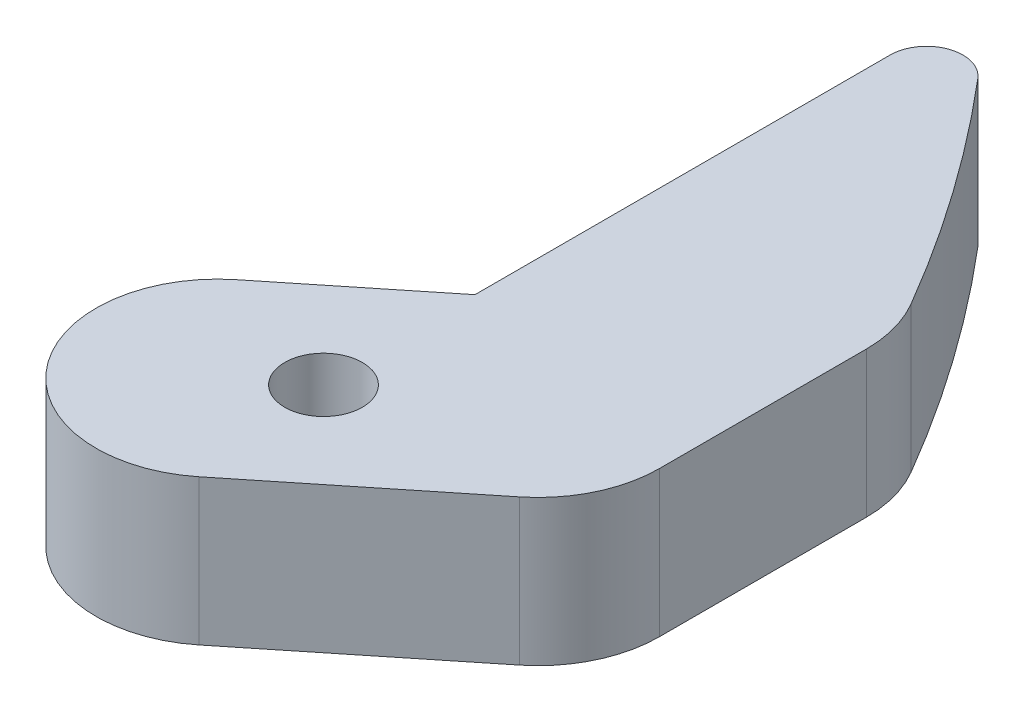
ISO-10303-21;
HEADER;
FILE_DESCRIPTION(('STEP AP214'),'2;1');
FILE_NAME('part.step','',(''),(''),'','','');
FILE_SCHEMA(('AUTOMOTIVE_DESIGN { 1 0 10303 214 1 1 1 1 }'));
ENDSEC;
DATA;
#1=APPLICATION_CONTEXT('core data for automotive mechanical design processes');
#2=APPLICATION_PROTOCOL_DEFINITION('international standard','automotive_design',2000,#1);
#3=PRODUCT_CONTEXT('',#1,'mechanical');
#4=PRODUCT('Part','Part','',(#3));
#5=PRODUCT_RELATED_PRODUCT_CATEGORY('part','',(#4));
#6=PRODUCT_DEFINITION_FORMATION('','',#4);
#7=PRODUCT_DEFINITION_CONTEXT('part definition',#1,'design');
#8=PRODUCT_DEFINITION('design','',#6,#7);
#9=PRODUCT_DEFINITION_SHAPE('','',#8);
#10=(LENGTH_UNIT() NAMED_UNIT(*) SI_UNIT(.MILLI.,.METRE.));
#11=(NAMED_UNIT(*) PLANE_ANGLE_UNIT() SI_UNIT($,.RADIAN.));
#12=(NAMED_UNIT(*) SI_UNIT($,.STERADIAN.) SOLID_ANGLE_UNIT());
#13=UNCERTAINTY_MEASURE_WITH_UNIT(LENGTH_MEASURE(1.E-05),#10,'distance_accuracy_value','');
#14=(GEOMETRIC_REPRESENTATION_CONTEXT(3) GLOBAL_UNCERTAINTY_ASSIGNED_CONTEXT((#13)) GLOBAL_UNIT_ASSIGNED_CONTEXT((#10,
#11,#12)) REPRESENTATION_CONTEXT('',''));
#15=CARTESIAN_POINT('',(0.,0.,0.));
#16=DIRECTION('',(0.,0.,1.));
#17=DIRECTION('',(1.,0.,0.));
#18=AXIS2_PLACEMENT_3D('',#15,#16,#17);
#19=CARTESIAN_POINT('',(-2.42195887519577,-6.,1.94672229834054));
#20=DIRECTION('',(0.,-1.,0.));
#21=DIRECTION('',(0.,0.,-1.));
#22=AXIS2_PLACEMENT_3D('',#19,#20,#21);
#23=CYLINDRICAL_SURFACE('',#22,4.99999999999996);
#24=CARTESIAN_POINT('',(-2.42195887519577,-12.,1.94672229834054));
#25=DIRECTION('',(0.,-1.,0.));
#26=DIRECTION('',(0.,0.,-1.));
#27=AXIS2_PLACEMENT_3D('',#24,#25,#26);
#28=CIRCLE('',#27,4.99999999999996);
#29=CARTESIAN_POINT('',(0.710490736046218,-12.,5.84386990050156));
#30=VERTEX_POINT('',#29);
#31=CARTESIAN_POINT('',(-5.55440848643782,-12.,-1.95042530382048));
#32=VERTEX_POINT('',#31);
#33=EDGE_CURVE('E135',#30,#32,#28,.T.);
#34=ORIENTED_EDGE('',*,*,#33,.F.);
#35=DIRECTION('',(0.,-1.,0.));
#36=VECTOR('',#35,1.);
#37=CARTESIAN_POINT('',(0.710490736046218,-6.,5.84386990050156));
#38=LINE('',#37,#36);
#39=CARTESIAN_POINT('',(0.710490736046218,-6.,5.84386990050156));
#40=VERTEX_POINT('',#39);
#41=EDGE_CURVE('E11',#40,#30,#38,.T.);
#42=ORIENTED_EDGE('',*,*,#41,.F.);
#43=CARTESIAN_POINT('',(-2.42195887519577,-6.,1.94672229834054));
#44=DIRECTION('',(0.,-1.,0.));
#45=DIRECTION('',(0.,0.,-1.));
#46=AXIS2_PLACEMENT_3D('',#43,#44,#45);
#47=CIRCLE('',#46,4.99999999999996);
#48=CARTESIAN_POINT('',(-5.55440848643782,-6.,-1.95042530382048));
#49=VERTEX_POINT('',#48);
#50=EDGE_CURVE('E159',#40,#49,#47,.T.);
#51=ORIENTED_EDGE('',*,*,#50,.T.);
#52=DIRECTION('',(0.,-1.,0.));
#53=VECTOR('',#52,1.);
#54=CARTESIAN_POINT('',(-5.55440848643782,-6.,-1.95042530382048));
#55=LINE('',#54,#53);
#56=EDGE_CURVE('E35',#49,#32,#55,.T.);
#57=ORIENTED_EDGE('',*,*,#56,.T.);
#58=EDGE_LOOP('',(#34,#42,#51,#57));
#59=FACE_BOUND('',#58,.T.);
#60=ADVANCED_FACE('F32',(#59),#23,.T.);
#61=CARTESIAN_POINT('',(8.03404776782973,-6.,-0.0426593560239417));
#62=DIRECTION('',(0.626489922248408,0.,0.779429520432209));
#63=DIRECTION('',(0.779429520432209,0.,-0.626489922248408));
#64=AXIS2_PLACEMENT_3D('',#61,#62,#63);
#65=PLANE('',#64);
#66=DIRECTION('',(-0.779429520432209,0.,0.626489922248408));
#67=VECTOR('',#66,1.);
#68=CARTESIAN_POINT('',(8.03404776782973,-12.,-0.0426593560239417));
#69=LINE('',#68,#67);
#70=CARTESIAN_POINT('',(8.03404776782973,-12.,-0.0426593560239417));
#71=VERTEX_POINT('',#70);
#72=EDGE_CURVE('E157',#71,#30,#69,.T.);
#73=ORIENTED_EDGE('',*,*,#72,.F.);
#74=DIRECTION('',(0.,-1.,0.));
#75=VECTOR('',#74,1.);
#76=CARTESIAN_POINT('',(8.03404776782973,-6.,-0.0426593560239417));
#77=LINE('',#76,#75);
#78=CARTESIAN_POINT('',(8.03404776782973,-6.,-0.0426593560239417));
#79=VERTEX_POINT('',#78);
#80=EDGE_CURVE('E41',#79,#71,#77,.T.);
#81=ORIENTED_EDGE('',*,*,#80,.F.);
#82=DIRECTION('',(-0.779429520432209,0.,0.626489922248408));
#83=VECTOR('',#82,1.);
#84=CARTESIAN_POINT('',(8.03404776782973,-6.,-0.0426593560239417));
#85=LINE('',#84,#83);
#86=EDGE_CURVE('E125',#79,#40,#85,.T.);
#87=ORIENTED_EDGE('',*,*,#86,.T.);
#88=ORIENTED_EDGE('',*,*,#41,.T.);
#89=EDGE_LOOP('',(#73,#81,#87,#88));
#90=FACE_BOUND('',#89,.T.);
#91=ADVANCED_FACE('F173',(#90),#65,.T.);
#92=CARTESIAN_POINT('',(4.90159815658769,-6.,-3.93980695818495));
#93=DIRECTION('',(0.,-1.,0.));
#94=DIRECTION('',(0.,0.,-1.));
#95=AXIS2_PLACEMENT_3D('',#92,#93,#94);
#96=CYLINDRICAL_SURFACE('',#95,4.99999999999999);
#97=CARTESIAN_POINT('',(4.90159815658769,-12.,-3.93980695818495));
#98=DIRECTION('',(0.,-1.,0.));
#99=DIRECTION('',(0.,0.,-1.));
#100=AXIS2_PLACEMENT_3D('',#97,#98,#99);
#101=CIRCLE('',#100,4.99999999999999);
#102=CARTESIAN_POINT('',(9.90159815658768,-12.,-3.93980695818495));
#103=VERTEX_POINT('',#102);
#104=EDGE_CURVE('E112',#103,#71,#101,.T.);
#105=ORIENTED_EDGE('',*,*,#104,.F.);
#106=DIRECTION('',(0.,-1.,0.));
#107=VECTOR('',#106,1.);
#108=CARTESIAN_POINT('',(9.90159815658768,-6.,-3.93980695818495));
#109=LINE('',#108,#107);
#110=CARTESIAN_POINT('',(9.90159815658768,-6.,-3.93980695818495));
#111=VERTEX_POINT('',#110);
#112=EDGE_CURVE('E107',#111,#103,#109,.T.);
#113=ORIENTED_EDGE('',*,*,#112,.F.);
#114=CARTESIAN_POINT('',(4.90159815658769,-6.,-3.93980695818495));
#115=DIRECTION('',(0.,-1.,0.));
#116=DIRECTION('',(0.,0.,-1.));
#117=AXIS2_PLACEMENT_3D('',#114,#115,#116);
#118=CIRCLE('',#117,4.99999999999999);
#119=EDGE_CURVE('E110',#111,#79,#118,.T.);
#120=ORIENTED_EDGE('',*,*,#119,.T.);
#121=ORIENTED_EDGE('',*,*,#80,.T.);
#122=EDGE_LOOP('',(#105,#113,#120,#121));
#123=FACE_BOUND('',#122,.T.);
#124=ADVANCED_FACE('F109',(#123),#96,.T.);
#125=CARTESIAN_POINT('',(9.90159815658769,-6.,-12.4542911190457));
#126=DIRECTION('',(1.,0.,0.));
#127=DIRECTION('',(0.,0.,-1.));
#128=AXIS2_PLACEMENT_3D('',#125,#126,#127);
#129=PLANE('',#128);
#130=DIRECTION('',(0.,0.,1.));
#131=VECTOR('',#130,1.);
#132=CARTESIAN_POINT('',(9.90159815658769,-12.,-12.4542911190457));
#133=LINE('',#132,#131);
#134=CARTESIAN_POINT('',(9.90159815658769,-12.,-12.4542911190457));
#135=VERTEX_POINT('',#134);
#136=EDGE_CURVE('E154',#135,#103,#133,.T.);
#137=ORIENTED_EDGE('',*,*,#136,.F.);
#138=DIRECTION('',(0.,-1.,0.));
#139=VECTOR('',#138,1.);
#140=CARTESIAN_POINT('',(9.90159815658769,-6.,-12.4542911190457));
#141=LINE('',#140,#139);
#142=CARTESIAN_POINT('',(9.90159815658769,-6.,-12.4542911190457));
#143=VERTEX_POINT('',#142);
#144=EDGE_CURVE('E117',#143,#135,#141,.T.);
#145=ORIENTED_EDGE('',*,*,#144,.F.);
#146=DIRECTION('',(0.,0.,1.));
#147=VECTOR('',#146,1.);
#148=CARTESIAN_POINT('',(9.90159815658769,-6.,-12.4542911190457));
#149=LINE('',#148,#147);
#150=EDGE_CURVE('E123',#143,#111,#149,.T.);
#151=ORIENTED_EDGE('',*,*,#150,.T.);
#152=ORIENTED_EDGE('',*,*,#112,.T.);
#153=EDGE_LOOP('',(#137,#145,#151,#152));
#154=FACE_BOUND('',#153,.T.);
#155=ADVANCED_FACE('F127',(#154),#129,.T.);
#156=CARTESIAN_POINT('',(4.90159815658768,-6.,-12.4542911190457));
#157=DIRECTION('',(0.,-1.,0.));
#158=DIRECTION('',(0.,0.,-1.));
#159=AXIS2_PLACEMENT_3D('',#156,#157,#158);
#160=CYLINDRICAL_SURFACE('',#159,5.00000000000001);
#161=CARTESIAN_POINT('',(4.90159815658768,-12.,-12.4542911190457));
#162=DIRECTION('',(0.,-1.,0.));
#163=DIRECTION('',(0.,0.,-1.));
#164=AXIS2_PLACEMENT_3D('',#161,#162,#163);
#165=CIRCLE('',#164,5.00000000000001);
#166=CARTESIAN_POINT('',(9.22072766167367,-12.,-14.9732433453287));
#167=VERTEX_POINT('',#166);
#168=EDGE_CURVE('E151',#167,#135,#165,.T.);
#169=ORIENTED_EDGE('',*,*,#168,.F.);
#170=DIRECTION('',(0.,-1.,0.));
#171=VECTOR('',#170,1.);
#172=CARTESIAN_POINT('',(9.22072766167367,-6.,-14.9732433453287));
#173=LINE('',#172,#171);
#174=CARTESIAN_POINT('',(9.22072766167367,-6.,-14.9732433453287));
#175=VERTEX_POINT('',#174);
#176=EDGE_CURVE('E163',#175,#167,#173,.T.);
#177=ORIENTED_EDGE('',*,*,#176,.F.);
#178=CARTESIAN_POINT('',(4.90159815658768,-6.,-12.4542911190457));
#179=DIRECTION('',(0.,-1.,0.));
#180=DIRECTION('',(0.,0.,-1.));
#181=AXIS2_PLACEMENT_3D('',#178,#179,#180);
#182=CIRCLE('',#181,5.00000000000001);
#183=EDGE_CURVE('E128',#175,#143,#182,.T.);
#184=ORIENTED_EDGE('',*,*,#183,.T.);
#185=ORIENTED_EDGE('',*,*,#144,.T.);
#186=EDGE_LOOP('',(#169,#177,#184,#185));
#187=FACE_BOUND('',#186,.T.);
#188=ADVANCED_FACE('F186',(#187),#160,.T.);
#189=CARTESIAN_POINT('',(-47.5984018434124,-6.,18.1641452404404));
#190=DIRECTION('',(0.,-1.,0.));
#191=DIRECTION('',(0.,0.,-1.));
#192=AXIS2_PLACEMENT_3D('',#189,#190,#191);
#193=CYLINDRICAL_SURFACE('',#192,65.7761354900088);
#194=CARTESIAN_POINT('',(-47.5984018434124,-12.,18.1641452404404));
#195=DIRECTION('',(0.,-1.,0.));
#196=DIRECTION('',(0.,0.,-1.));
#197=AXIS2_PLACEMENT_3D('',#194,#195,#196);
#198=CIRCLE('',#197,65.7761354900088);
#199=CARTESIAN_POINT('',(2.54510187596464,-12.,-24.4049636854559));
#200=VERTEX_POINT('',#199);
#201=EDGE_CURVE('E148',#200,#167,#198,.T.);
#202=ORIENTED_EDGE('',*,*,#201,.F.);
#203=DIRECTION('',(0.,-1.,0.));
#204=VECTOR('',#203,1.);
#205=CARTESIAN_POINT('',(2.54510187596464,-6.,-24.4049636854559));
#206=LINE('',#205,#204);
#207=CARTESIAN_POINT('',(2.54510187596464,-6.,-24.4049636854559));
#208=VERTEX_POINT('',#207);
#209=EDGE_CURVE('E165',#208,#200,#206,.T.);
#210=ORIENTED_EDGE('',*,*,#209,.F.);
#211=CARTESIAN_POINT('',(-47.5984018434124,-6.,18.1641452404404));
#212=DIRECTION('',(0.,-1.,0.));
#213=DIRECTION('',(0.,0.,-1.));
#214=AXIS2_PLACEMENT_3D('',#211,#212,#213);
#215=CIRCLE('',#214,65.7761354900088);
#216=EDGE_CURVE('E130',#208,#175,#215,.T.);
#217=ORIENTED_EDGE('',*,*,#216,.T.);
#218=ORIENTED_EDGE('',*,*,#176,.T.);
#219=EDGE_LOOP('',(#202,#210,#217,#218));
#220=FACE_BOUND('',#219,.T.);
#221=ADVANCED_FACE('F189',(#220),#193,.T.);
#222=CARTESIAN_POINT('',(1.4015981565877,-6.,-23.4341911869933));
#223=DIRECTION('',(0.,-1.,0.));
#224=DIRECTION('',(0.,0.,-1.));
#225=AXIS2_PLACEMENT_3D('',#222,#223,#224);
#226=CYLINDRICAL_SURFACE('',#225,1.50000000000002);
#227=CARTESIAN_POINT('',(1.4015981565877,-12.,-23.4341911869933));
#228=DIRECTION('',(0.,-1.,0.));
#229=DIRECTION('',(0.,0.,-1.));
#230=AXIS2_PLACEMENT_3D('',#227,#228,#229);
#231=CIRCLE('',#230,1.50000000000002);
#232=CARTESIAN_POINT('',(-0.0984018434123134,-12.,-23.4341911869933));
#233=VERTEX_POINT('',#232);
#234=EDGE_CURVE('E145',#233,#200,#231,.T.);
#235=ORIENTED_EDGE('',*,*,#234,.F.);
#236=DIRECTION('',(0.,-1.,0.));
#237=VECTOR('',#236,1.);
#238=CARTESIAN_POINT('',(-0.0984018434123134,-6.,-23.4341911869933));
#239=LINE('',#238,#237);
#240=CARTESIAN_POINT('',(-0.0984018434123134,-6.,-23.4341911869933));
#241=VERTEX_POINT('',#240);
#242=EDGE_CURVE('E167',#241,#233,#239,.T.);
#243=ORIENTED_EDGE('',*,*,#242,.F.);
#244=CARTESIAN_POINT('',(1.4015981565877,-6.,-23.4341911869933));
#245=DIRECTION('',(0.,-1.,0.));
#246=DIRECTION('',(0.,0.,-1.));
#247=AXIS2_PLACEMENT_3D('',#244,#245,#246);
#248=CIRCLE('',#247,1.50000000000002);
#249=EDGE_CURVE('E231',#241,#208,#248,.T.);
#250=ORIENTED_EDGE('',*,*,#249,.T.);
#251=ORIENTED_EDGE('',*,*,#209,.T.);
#252=EDGE_LOOP('',(#235,#243,#250,#251));
#253=FACE_BOUND('',#252,.T.);
#254=ADVANCED_FACE('F193',(#253),#226,.T.);
#255=CARTESIAN_POINT('',(-0.0984018434123102,-6.,-6.3358547595594));
#256=DIRECTION('',(-1.,0.,0.));
#257=DIRECTION('',(0.,0.,1.));
#258=AXIS2_PLACEMENT_3D('',#255,#256,#257);
#259=PLANE('',#258);
#260=DIRECTION('',(0.,0.,-1.));
#261=VECTOR('',#260,1.);
#262=CARTESIAN_POINT('',(-0.0984018434123102,-12.,-6.3358547595594));
#263=LINE('',#262,#261);
#264=CARTESIAN_POINT('',(-0.0984018434123102,-12.,-6.3358547595594));
#265=VERTEX_POINT('',#264);
#266=EDGE_CURVE('E142',#265,#233,#263,.T.);
#267=ORIENTED_EDGE('',*,*,#266,.F.);
#268=DIRECTION('',(0.,-1.,0.));
#269=VECTOR('',#268,1.);
#270=CARTESIAN_POINT('',(-0.0984018434123102,-6.,-6.3358547595594));
#271=LINE('',#270,#269);
#272=CARTESIAN_POINT('',(-0.0984018434123102,-6.,-6.3358547595594));
#273=VERTEX_POINT('',#272);
#274=EDGE_CURVE('E168',#273,#265,#271,.T.);
#275=ORIENTED_EDGE('',*,*,#274,.F.);
#276=DIRECTION('',(0.,0.,-1.));
#277=VECTOR('',#276,1.);
#278=CARTESIAN_POINT('',(-0.0984018434123102,-6.,-6.3358547595594));
#279=LINE('',#278,#277);
#280=EDGE_CURVE('E228',#273,#241,#279,.T.);
#281=ORIENTED_EDGE('',*,*,#280,.T.);
#282=ORIENTED_EDGE('',*,*,#242,.T.);
#283=EDGE_LOOP('',(#267,#275,#281,#282));
#284=FACE_BOUND('',#283,.T.);
#285=ADVANCED_FACE('F197',(#284),#259,.T.);
#286=CARTESIAN_POINT('',(-5.55440848643782,-6.,-1.95042530382048));
#287=DIRECTION('',(-0.62648992224841,0.,-0.779429520432207));
#288=DIRECTION('',(-0.779429520432207,0.,0.626489922248411));
#289=AXIS2_PLACEMENT_3D('',#286,#287,#288);
#290=PLANE('',#289);
#291=DIRECTION('',(0.779429520432207,0.,-0.626489922248411));
#292=VECTOR('',#291,1.);
#293=CARTESIAN_POINT('',(-5.55440848643782,-12.,-1.95042530382048));
#294=LINE('',#293,#292);
#295=EDGE_CURVE('E138',#32,#265,#294,.T.);
#296=ORIENTED_EDGE('',*,*,#295,.F.);
#297=ORIENTED_EDGE('',*,*,#56,.F.);
#298=DIRECTION('',(0.779429520432207,0.,-0.626489922248411));
#299=VECTOR('',#298,1.);
#300=CARTESIAN_POINT('',(-5.55440848643782,-6.,-1.95042530382048));
#301=LINE('',#300,#299);
#302=EDGE_CURVE('E226',#49,#273,#301,.T.);
#303=ORIENTED_EDGE('',*,*,#302,.T.);
#304=ORIENTED_EDGE('',*,*,#274,.T.);
#305=EDGE_LOOP('',(#296,#297,#303,#304));
#306=FACE_BOUND('',#305,.T.);
#307=ADVANCED_FACE('F170',(#306),#290,.T.);
#308=CARTESIAN_POINT('',(-2.42195887519577,-6.,1.94672229834054));
#309=DIRECTION('',(0.,-1.,0.));
#310=DIRECTION('',(0.,0.,-1.));
#311=AXIS2_PLACEMENT_3D('',#308,#309,#310);
#312=PLANE('',#311);
#313=CARTESIAN_POINT('',(0.,-6.,0.));
#314=DIRECTION('',(0.,-1.,0.));
#315=DIRECTION('',(0.,0.,1.));
#316=AXIS2_PLACEMENT_3D('',#313,#314,#315);
#317=CIRCLE('',#316,1.6);
#318=CARTESIAN_POINT('',(0.,-6.,1.6));
#319=VERTEX_POINT('',#318);
#320=EDGE_CURVE('E139',#319,#319,#317,.T.);
#321=ORIENTED_EDGE('',*,*,#320,.T.);
#322=EDGE_LOOP('',(#321));
#323=FACE_BOUND('',#322,.T.);
#324=ORIENTED_EDGE('',*,*,#50,.F.);
#325=ORIENTED_EDGE('',*,*,#86,.F.);
#326=ORIENTED_EDGE('',*,*,#119,.F.);
#327=ORIENTED_EDGE('',*,*,#150,.F.);
#328=ORIENTED_EDGE('',*,*,#183,.F.);
#329=ORIENTED_EDGE('',*,*,#216,.F.);
#330=ORIENTED_EDGE('',*,*,#249,.F.);
#331=ORIENTED_EDGE('',*,*,#280,.F.);
#332=ORIENTED_EDGE('',*,*,#302,.F.);
#333=EDGE_LOOP('',(#324,#325,#326,#327,#328,#329,#330,#331,#332));
#334=FACE_BOUND('',#333,.T.);
#335=ADVANCED_FACE('F121',(#323,#334),#312,.F.);
#336=CARTESIAN_POINT('',(-2.42195887519577,-12.,1.94672229834054));
#337=DIRECTION('',(0.,-1.,0.));
#338=DIRECTION('',(0.,0.,-1.));
#339=AXIS2_PLACEMENT_3D('',#336,#337,#338);
#340=PLANE('',#339);
#341=CARTESIAN_POINT('',(0.,-12.,0.));
#342=DIRECTION('',(0.,-1.,0.));
#343=DIRECTION('',(0.,0.,1.));
#344=AXIS2_PLACEMENT_3D('',#341,#342,#343);
#345=CIRCLE('',#344,1.6);
#346=CARTESIAN_POINT('',(0.,-12.,1.6));
#347=VERTEX_POINT('',#346);
#348=EDGE_CURVE('E221',#347,#347,#345,.T.);
#349=ORIENTED_EDGE('',*,*,#348,.F.);
#350=EDGE_LOOP('',(#349));
#351=FACE_BOUND('',#350,.T.);
#352=ORIENTED_EDGE('',*,*,#33,.T.);
#353=ORIENTED_EDGE('',*,*,#295,.T.);
#354=ORIENTED_EDGE('',*,*,#266,.T.);
#355=ORIENTED_EDGE('',*,*,#234,.T.);
#356=ORIENTED_EDGE('',*,*,#201,.T.);
#357=ORIENTED_EDGE('',*,*,#168,.T.);
#358=ORIENTED_EDGE('',*,*,#136,.T.);
#359=ORIENTED_EDGE('',*,*,#104,.T.);
#360=ORIENTED_EDGE('',*,*,#72,.T.);
#361=EDGE_LOOP('',(#352,#353,#354,#355,#356,#357,#358,#359,#360));
#362=FACE_BOUND('',#361,.T.);
#363=ADVANCED_FACE('F172',(#351,#362),#340,.T.);
#364=CARTESIAN_POINT('',(0.,-6.,0.));
#365=DIRECTION('',(0.,-1.,0.));
#366=DIRECTION('',(0.,0.,-1.));
#367=AXIS2_PLACEMENT_3D('',#364,#365,#366);
#368=CYLINDRICAL_SURFACE('',#367,1.6);
#369=ORIENTED_EDGE('',*,*,#320,.F.);
#370=EDGE_LOOP('',(#369));
#371=FACE_BOUND('',#370,.T.);
#372=ORIENTED_EDGE('',*,*,#348,.T.);
#373=EDGE_LOOP('',(#372));
#374=FACE_BOUND('',#373,.T.);
#375=ADVANCED_FACE('F209',(#371,#374),#368,.F.);
#376=CLOSED_SHELL('',(#60,#91,#124,#155,#188,#221,#254,#285,#307,#335,#363,#375));
#377=MANIFOLD_SOLID_BREP('B2',#376);
#378=ADVANCED_BREP_SHAPE_REPRESENTATION('',(#18,#377),#14);
#379=SHAPE_DEFINITION_REPRESENTATION(#9,#378);
ENDSEC;
END-ISO-10303-21;
